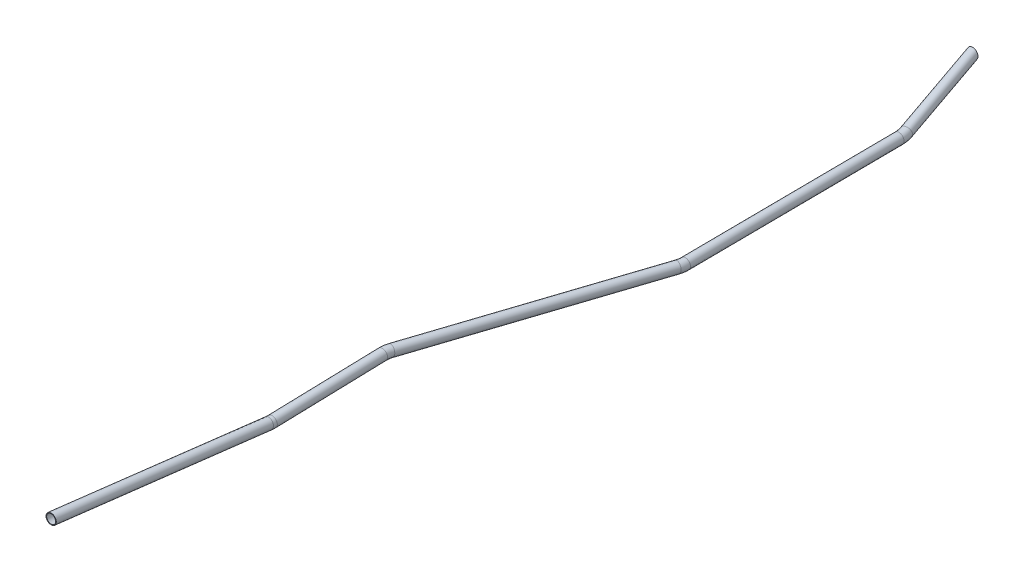
ISO-10303-21;
HEADER;
FILE_DESCRIPTION(('STEP AP214'),'2;1');
FILE_NAME('part.step','',(''),(''),'','','');
FILE_SCHEMA(('AUTOMOTIVE_DESIGN { 1 0 10303 214 1 1 1 1 }'));
ENDSEC;
DATA;
#1=APPLICATION_CONTEXT('core data for automotive mechanical design processes');
#2=APPLICATION_PROTOCOL_DEFINITION('international standard','automotive_design',2000,#1);
#3=PRODUCT_CONTEXT('',#1,'mechanical');
#4=PRODUCT('Part','Part','',(#3));
#5=PRODUCT_RELATED_PRODUCT_CATEGORY('part','',(#4));
#6=PRODUCT_DEFINITION_FORMATION('','',#4);
#7=PRODUCT_DEFINITION_CONTEXT('part definition',#1,'design');
#8=PRODUCT_DEFINITION('design','',#6,#7);
#9=PRODUCT_DEFINITION_SHAPE('','',#8);
#10=(LENGTH_UNIT() NAMED_UNIT(*) SI_UNIT(.MILLI.,.METRE.));
#11=(NAMED_UNIT(*) PLANE_ANGLE_UNIT() SI_UNIT($,.RADIAN.));
#12=(NAMED_UNIT(*) SI_UNIT($,.STERADIAN.) SOLID_ANGLE_UNIT());
#13=UNCERTAINTY_MEASURE_WITH_UNIT(LENGTH_MEASURE(1.E-05),#10,'distance_accuracy_value','');
#14=(GEOMETRIC_REPRESENTATION_CONTEXT(3) GLOBAL_UNCERTAINTY_ASSIGNED_CONTEXT((#13)) GLOBAL_UNIT_ASSIGNED_CONTEXT((#10,
#11,#12)) REPRESENTATION_CONTEXT('',''));
#15=CARTESIAN_POINT('',(0.,0.,0.));
#16=DIRECTION('',(0.,0.,1.));
#17=DIRECTION('',(1.,0.,0.));
#18=AXIS2_PLACEMENT_3D('',#15,#16,#17);
#19=CARTESIAN_POINT('',(199.717136613278,120.618998802633,638.647885750356));
#20=DIRECTION('',(0.00232098852154133,-0.0257434175815316,0.999665888916644));
#21=DIRECTION('',(0.,-0.999668581521457,-0.0257434869215488));
#22=AXIS2_PLACEMENT_3D('',#19,#20,#21);
#23=CYLINDRICAL_SURFACE('',#22,11.049);
#24=CARTESIAN_POINT('',(199.717136613278,120.618998802633,638.647885750356));
#25=DIRECTION('',(0.00232098852154094,-0.0257434175815307,0.999665888916644));
#26=DIRECTION('',(0.,-0.999668581521458,-0.0257434869215479));
#27=AXIS2_PLACEMENT_3D('',#24,#25,#26);
#28=CIRCLE('',#27,11.049);
#29=CARTESIAN_POINT('',(189.809360472102,125.507168864727,638.796769531893));
#30=VERTEX_POINT('',#29);
#31=EDGE_CURVE('E81',#30,#30,#28,.F.);
#32=ORIENTED_EDGE('',*,*,#31,.T.);
#33=EDGE_LOOP('',(#32));
#34=FACE_BOUND('',#33,.T.);
#35=CARTESIAN_POINT('',(200.351887993532,113.578606447965,912.039717245196));
#36=DIRECTION('',(-0.00232098852154094,0.0257434175815307,-0.999665888916644));
#37=DIRECTION('',(0.,0.999668581521458,0.0257434869215479));
#38=AXIS2_PLACEMENT_3D('',#35,#36,#37);
#39=CIRCLE('',#38,11.049);
#40=CARTESIAN_POINT('',(206.675191736784,104.521301997679,911.791792124633));
#41=VERTEX_POINT('',#40);
#42=EDGE_CURVE('E66',#41,#41,#39,.F.);
#43=ORIENTED_EDGE('',*,*,#42,.T.);
#44=EDGE_LOOP('',(#43));
#45=FACE_BOUND('',#44,.T.);
#46=ADVANCED_FACE('F43',(#34,#45),#23,.F.);
#47=CARTESIAN_POINT('',(199.717136613278,120.618998802633,638.647885750356));
#48=DIRECTION('',(0.00232098852154133,-0.0257434175815316,0.999665888916644));
#49=DIRECTION('',(0.,-0.999668581521457,-0.0257434869215488));
#50=AXIS2_PLACEMENT_3D('',#47,#48,#49);
#51=CYLINDRICAL_SURFACE('',#50,12.7);
#52=CARTESIAN_POINT('',(199.717136613278,120.618998802633,638.647885750356));
#53=DIRECTION('',(-0.00232098852154094,0.0257434175815307,-0.999665888916644));
#54=DIRECTION('',(0.,0.999668581521458,0.0257434869215479));
#55=AXIS2_PLACEMENT_3D('',#52,#53,#54);
#56=CIRCLE('',#55,12.7);
#57=CARTESIAN_POINT('',(188.328888175145,126.237585080902,638.819016533732));
#58=VERTEX_POINT('',#57);
#59=EDGE_CURVE('E51',#58,#58,#56,.T.);
#60=ORIENTED_EDGE('',*,*,#59,.F.);
#61=EDGE_LOOP('',(#60));
#62=FACE_BOUND('',#61,.T.);
#63=CARTESIAN_POINT('',(200.351887993532,113.578606447965,912.039717245196));
#64=DIRECTION('',(0.00232098852154094,-0.0257434175815307,0.999665888916644));
#65=DIRECTION('',(0.,-0.999668581521458,-0.0257434869215479));
#66=AXIS2_PLACEMENT_3D('',#63,#64,#65);
#67=CIRCLE('',#66,12.7);
#68=CARTESIAN_POINT('',(207.620053215661,103.167911677521,911.75474584225));
#69=VERTEX_POINT('',#68);
#70=EDGE_CURVE('E10',#69,#69,#67,.T.);
#71=ORIENTED_EDGE('',*,*,#70,.F.);
#72=EDGE_LOOP('',(#71));
#73=FACE_BOUND('',#72,.T.);
#74=ADVANCED_FACE('F45',(#62,#73),#51,.T.);
#75=CARTESIAN_POINT('',(155.579990225219,177.708486233896,913.795141087348));
#76=DIRECTION('',(-0.820043510217333,-0.572157343537613,-0.0128302605749096));
#77=DIRECTION('',(0.572204442360909,-0.820111014523303,0.));
#78=AXIS2_PLACEMENT_3D('',#75,#76,#77);
#79=TOROIDAL_SURFACE('',#78,78.231999999999,11.049);
#80=CARTESIAN_POINT('',(200.097461671143,113.749121177836,920.697327819599));
#81=DIRECTION('',(-0.0609693238725879,0.0650491189961044,0.996017747665346));
#82=DIRECTION('',(0.,-0.997874152520216,0.0651703593059209));
#83=AXIS2_PLACEMENT_3D('',#80,#81,#82);
#84=CIRCLE('',#83,11.049);
#85=CARTESIAN_POINT('',(206.384831826655,104.715899165049,921.672149647044));
#86=VERTEX_POINT('',#85);
#87=EDGE_CURVE('E57',#86,#86,#84,.F.);
#88=CARTESIAN_POINT('',(155.579990225219,177.708486233896,913.795141087348));
#89=DIRECTION('',(-0.820043510217333,-0.572157343537613,-0.0128302605749096));
#90=DIRECTION('',(0.572204442360909,-0.820111014523303,0.));
#91=AXIS2_PLACEMENT_3D('',#88,#89,#90);
#92=CIRCLE('',#91,89.2809999999991);
#93=EDGE_CURVE('',#41,#86,#92,.T.);
#94=ORIENTED_EDGE('',*,*,#42,.F.);
#95=ORIENTED_EDGE('',*,*,#87,.F.);
#96=ORIENTED_EDGE('',*,*,#93,.T.);
#97=ORIENTED_EDGE('',*,*,#93,.F.);
#98=EDGE_LOOP('',(#94,#96,#95,#97));
#99=FACE_BOUND('',#98,.T.);
#100=ADVANCED_FACE('F153',(#99),#79,.F.);
#101=CARTESIAN_POINT('',(155.579990225219,177.708486233896,913.795141087348));
#102=DIRECTION('',(-0.820043510217333,-0.572157343537613,-0.0128302605749096));
#103=DIRECTION('',(0.572204442360909,-0.820111014523303,0.));
#104=AXIS2_PLACEMENT_3D('',#101,#102,#103);
#105=TOROIDAL_SURFACE('',#104,78.231999999999,12.7);
#106=CARTESIAN_POINT('',(200.097461671143,113.749121177836,920.697327819599));
#107=DIRECTION('',(-0.0609693238725879,0.0650491189961044,0.996017747665346));
#108=DIRECTION('',(0.,-0.997874152520216,0.0651703593059209));
#109=AXIS2_PLACEMENT_3D('',#106,#107,#108);
#110=CIRCLE('',#109,12.7);
#111=CARTESIAN_POINT('',(207.324323918858,103.366107370034,921.817812678731));
#112=VERTEX_POINT('',#111);
#113=EDGE_CURVE('E63',#112,#112,#110,.T.);
#114=CARTESIAN_POINT('',(155.579990225219,177.708486233896,913.795141087348));
#115=DIRECTION('',(-0.820043510217333,-0.572157343537613,-0.0128302605749096));
#116=DIRECTION('',(0.572204442360909,-0.820111014523303,0.));
#117=AXIS2_PLACEMENT_3D('',#114,#115,#116);
#118=CIRCLE('',#117,90.931999999999);
#119=EDGE_CURVE('',#69,#112,#118,.T.);
#120=ORIENTED_EDGE('',*,*,#70,.T.);
#121=ORIENTED_EDGE('',*,*,#113,.F.);
#122=ORIENTED_EDGE('',*,*,#119,.T.);
#123=ORIENTED_EDGE('',*,*,#119,.F.);
#124=EDGE_LOOP('',(#120,#122,#121,#123));
#125=FACE_BOUND('',#124,.T.);
#126=ADVANCED_FACE('F157',(#125),#105,.T.);
#127=CARTESIAN_POINT('',(200.097461671143,113.749121177836,920.697327819599));
#128=DIRECTION('',(-0.060969323872588,0.0650491189961044,0.996017747665346));
#129=DIRECTION('',(0.,-0.997874152520216,0.0651703593059209));
#130=AXIS2_PLACEMENT_3D('',#127,#128,#129);
#131=CYLINDRICAL_SURFACE('',#130,11.049);
#132=CARTESIAN_POINT('',(169.052406241099,146.871573201904,1427.86100000001));
#133=DIRECTION('',(0.,0.,1.));
#134=DIRECTION('',(-0.683856204975952,0.729616811015132,0.));
#135=AXIS2_PLACEMENT_3D('',#132,#133,#134);
#136=ELLIPSE('',#135,11.0931758253292,11.049);
#137=CARTESIAN_POINT('',(161.466269120058,154.96534077161,1427.86100000001));
#138=VERTEX_POINT('',#137);
#139=EDGE_CURVE('E77',#138,#138,#136,.T.);
#140=ORIENTED_EDGE('',*,*,#139,.T.);
#141=EDGE_LOOP('',(#140));
#142=FACE_BOUND('',#141,.T.);
#143=ORIENTED_EDGE('',*,*,#87,.T.);
#144=EDGE_LOOP('',(#143));
#145=FACE_BOUND('',#144,.T.);
#146=ADVANCED_FACE('F160',(#142,#145),#131,.F.);
#147=CARTESIAN_POINT('',(200.097461671143,113.749121177836,920.697327819599));
#148=DIRECTION('',(-0.060969323872588,0.0650491189961044,0.996017747665346));
#149=DIRECTION('',(0.,-0.997874152520216,0.0651703593059209));
#150=AXIS2_PLACEMENT_3D('',#147,#148,#149);
#151=CYLINDRICAL_SURFACE('',#150,12.7);
#152=CARTESIAN_POINT('',(169.052406241099,146.871573201904,1427.86100000001));
#153=DIRECTION('',(0.,0.,1.));
#154=DIRECTION('',(-0.683856204975952,0.729616811015132,0.));
#155=AXIS2_PLACEMENT_3D('',#152,#153,#154);
#156=ELLIPSE('',#155,12.7507768107232,12.7);
#157=CARTESIAN_POINT('',(160.332708400823,156.174754316509,1427.86100000001));
#158=VERTEX_POINT('',#157);
#159=EDGE_CURVE('E70',#158,#158,#156,.T.);
#160=ORIENTED_EDGE('',*,*,#159,.F.);
#161=EDGE_LOOP('',(#160));
#162=FACE_BOUND('',#161,.T.);
#163=ORIENTED_EDGE('',*,*,#113,.T.);
#164=EDGE_LOOP('',(#163));
#165=FACE_BOUND('',#164,.T.);
#166=ADVANCED_FACE('F164',(#162,#165),#151,.T.);
#167=CARTESIAN_POINT('',(-171.449999999902,131.825999999957,1427.86100000004));
#168=DIRECTION('',(0.,0.,1.));
#169=DIRECTION('',(1.,0.,0.));
#170=AXIS2_PLACEMENT_3D('',#167,#168,#169);
#171=PLANE('',#170);
#172=ORIENTED_EDGE('',*,*,#139,.F.);
#173=EDGE_LOOP('',(#172));
#174=FACE_BOUND('',#173,.T.);
#175=ORIENTED_EDGE('',*,*,#159,.T.);
#176=EDGE_LOOP('',(#175));
#177=FACE_BOUND('',#176,.T.);
#178=ADVANCED_FACE('F167',(#174,#177),#171,.T.);
#179=CARTESIAN_POINT('',(269.868746992175,86.0085073284976,637.593720124759));
#180=DIRECTION('',(0.442607443900622,0.896444148873497,0.0220576189610958));
#181=DIRECTION('',(-0.896662305803115,0.442715155999704,0.));
#182=AXIS2_PLACEMENT_3D('',#179,#180,#181);
#183=TOROIDAL_SURFACE('',#182,78.2320000000001,11.049);
#184=CARTESIAN_POINT('',(201.719236998237,120.092556861122,619.868944271627));
#185=DIRECTION('',(0.212714548789191,-0.0810653161140511,-0.973745826823787));
#186=DIRECTION('',(-0.976961210122492,0.,-0.213416948520956));
#187=AXIS2_PLACEMENT_3D('',#184,#185,#186);
#188=CIRCLE('',#187,11.049);
#189=CARTESIAN_POINT('',(192.094225034808,124.906375545113,617.36560742224));
#190=VERTEX_POINT('',#189);
#191=EDGE_CURVE('E85',#190,#190,#188,.F.);
#192=CARTESIAN_POINT('',(269.868746992175,86.0085073284976,637.593720124759));
#193=DIRECTION('',(0.442607443900622,0.896444148873497,0.0220576189610958));
#194=DIRECTION('',(-0.896662305803115,0.442715155999704,0.));
#195=AXIS2_PLACEMENT_3D('',#192,#193,#194);
#196=CIRCLE('',#195,89.2810000000001);
#197=EDGE_CURVE('',#190,#30,#196,.T.);
#198=ORIENTED_EDGE('',*,*,#191,.F.);
#199=ORIENTED_EDGE('',*,*,#31,.F.);
#200=ORIENTED_EDGE('',*,*,#197,.T.);
#201=ORIENTED_EDGE('',*,*,#197,.F.);
#202=EDGE_LOOP('',(#198,#200,#199,#201));
#203=FACE_BOUND('',#202,.T.);
#204=ADVANCED_FACE('F174',(#203),#183,.F.);
#205=CARTESIAN_POINT('',(269.868746992175,86.0085073284976,637.593720124759));
#206=DIRECTION('',(0.442607443900622,0.896444148873497,0.0220576189610958));
#207=DIRECTION('',(-0.896662305803115,0.442715155999704,0.));
#208=AXIS2_PLACEMENT_3D('',#205,#206,#207);
#209=TOROIDAL_SURFACE('',#208,78.2320000000001,12.7);
#210=CARTESIAN_POINT('',(201.719236998237,120.092556861122,619.868944271627));
#211=DIRECTION('',(0.212714548789191,-0.0810653161140511,-0.973745826823787));
#212=DIRECTION('',(-0.976961210122492,0.,-0.213416948520956));
#213=AXIS2_PLACEMENT_3D('',#210,#211,#212);
#214=CIRCLE('',#213,12.7);
#215=CARTESIAN_POINT('',(190.656004856364,125.62568178525,616.991545594171));
#216=VERTEX_POINT('',#215);
#217=EDGE_CURVE('E86',#216,#216,#214,.T.);
#218=CARTESIAN_POINT('',(269.868746992175,86.0085073284976,637.593720124759));
#219=DIRECTION('',(0.442607443900622,0.896444148873497,0.0220576189610958));
#220=DIRECTION('',(-0.896662305803115,0.442715155999704,0.));
#221=AXIS2_PLACEMENT_3D('',#218,#219,#220);
#222=CIRCLE('',#221,90.9320000000001);
#223=EDGE_CURVE('',#216,#58,#222,.T.);
#224=ORIENTED_EDGE('',*,*,#217,.F.);
#225=ORIENTED_EDGE('',*,*,#59,.T.);
#226=ORIENTED_EDGE('',*,*,#223,.T.);
#227=ORIENTED_EDGE('',*,*,#223,.F.);
#228=EDGE_LOOP('',(#224,#226,#225,#227));
#229=FACE_BOUND('',#228,.T.);
#230=ADVANCED_FACE('F176',(#229),#209,.T.);
#231=CARTESIAN_POINT('',(328.732320897366,71.687989070569,38.4396950604416));
#232=DIRECTION('',(-0.212714548789192,0.0810653161140514,0.973745826823787));
#233=DIRECTION('',(0.976961210122492,0.,0.213416948520958));
#234=AXIS2_PLACEMENT_3D('',#231,#232,#233);
#235=CYLINDRICAL_SURFACE('',#234,11.049);
#236=CARTESIAN_POINT('',(328.73232089736,71.6879890705716,38.4396950604716));
#237=DIRECTION('',(-0.212714548789191,0.0810653161140512,0.973745826823787));
#238=DIRECTION('',(0.976961210122492,0.,0.213416948520956));
#239=AXIS2_PLACEMENT_3D('',#236,#237,#238);
#240=CIRCLE('',#239,11.049);
#241=CARTESIAN_POINT('',(338.84256325762,68.0084958401836,40.9545966458891));
#242=VERTEX_POINT('',#241);
#243=EDGE_CURVE('E105',#242,#242,#240,.F.);
#244=ORIENTED_EDGE('',*,*,#243,.T.);
#245=EDGE_LOOP('',(#244));
#246=FACE_BOUND('',#245,.T.);
#247=ORIENTED_EDGE('',*,*,#191,.T.);
#248=EDGE_LOOP('',(#247));
#249=FACE_BOUND('',#248,.T.);
#250=ADVANCED_FACE('F179',(#246,#249),#235,.F.);
#251=CARTESIAN_POINT('',(328.732320897366,71.687989070569,38.4396950604416));
#252=DIRECTION('',(-0.212714548789192,0.0810653161140514,0.973745826823787));
#253=DIRECTION('',(0.976961210122492,0.,0.213416948520958));
#254=AXIS2_PLACEMENT_3D('',#251,#252,#253);
#255=CYLINDRICAL_SURFACE('',#254,12.7);
#256=CARTESIAN_POINT('',(328.732320897366,71.6879890705691,38.4396950604423));
#257=DIRECTION('',(0.212714548789191,-0.0810653161140512,-0.973745826823787));
#258=DIRECTION('',(-0.976961210122492,0.,-0.213416948520956));
#259=AXIS2_PLACEMENT_3D('',#256,#257,#258);
#260=CIRCLE('',#259,12.7);
#261=CARTESIAN_POINT('',(340.353289127551,67.4586865069043,41.330386537929));
#262=VERTEX_POINT('',#261);
#263=EDGE_CURVE('E90',#262,#262,#260,.T.);
#264=ORIENTED_EDGE('',*,*,#263,.F.);
#265=EDGE_LOOP('',(#264));
#266=FACE_BOUND('',#265,.T.);
#267=ORIENTED_EDGE('',*,*,#217,.T.);
#268=EDGE_LOOP('',(#267));
#269=FACE_BOUND('',#268,.T.);
#270=ADVANCED_FACE('F184',(#266,#269),#255,.T.);
#271=CARTESIAN_POINT('',(326.042536735937,70.7076293310306,-513.238441419266));
#272=DIRECTION('',(0.00861756932364095,0.000411780998233343,0.99996278327514));
#273=DIRECTION('',(0.999962868053789,0.,-0.00861757005425391));
#274=AXIS2_PLACEMENT_3D('',#271,#272,#273);
#275=CYLINDRICAL_SURFACE('',#274,11.049);
#276=CARTESIAN_POINT('',(326.042536735937,70.7076293310306,-513.238441419236));
#277=DIRECTION('',(0.00861756932328609,0.000411780998393395,0.999962783275142));
#278=DIRECTION('',(0.999962868053793,0.,-0.00861757005389911));
#279=AXIS2_PLACEMENT_3D('',#276,#277,#278);
#280=CIRCLE('',#279,11.049);
#281=CARTESIAN_POINT('',(335.142372679219,64.4412400228412,-513.314282328812));
#282=VERTEX_POINT('',#281);
#283=EDGE_CURVE('E113',#282,#282,#280,.F.);
#284=ORIENTED_EDGE('',*,*,#283,.T.);
#285=EDGE_LOOP('',(#284));
#286=FACE_BOUND('',#285,.T.);
#287=CARTESIAN_POINT('',(330.638019560941,70.9272193840925,20.0107409896821));
#288=DIRECTION('',(-0.00861756932327695,-0.000411780998366864,-0.999962783275142));
#289=DIRECTION('',(-0.999962868053793,0.,0.00861757005388999));
#290=AXIS2_PLACEMENT_3D('',#287,#288,#289);
#291=CIRCLE('',#290,11.049);
#292=CARTESIAN_POINT('',(341.017410920765,67.1402797856466,19.922851983933));
#293=VERTEX_POINT('',#292);
#294=EDGE_CURVE('E109',#293,#293,#291,.F.);
#295=ORIENTED_EDGE('',*,*,#294,.T.);
#296=EDGE_LOOP('',(#295));
#297=FACE_BOUND('',#296,.T.);
#298=ADVANCED_FACE('F187',(#286,#297),#275,.F.);
#299=CARTESIAN_POINT('',(326.042536735937,70.7076293310306,-513.238441419266));
#300=DIRECTION('',(0.00861756932364095,0.000411780998233343,0.99996278327514));
#301=DIRECTION('',(0.999962868053789,0.,-0.00861757005425391));
#302=AXIS2_PLACEMENT_3D('',#299,#300,#301);
#303=CYLINDRICAL_SURFACE('',#302,12.7);
#304=CARTESIAN_POINT('',(326.042536735937,70.7076293310306,-513.238441419266));
#305=DIRECTION('',(-0.00861756932328609,-0.000411780998393395,-0.999962783275142));
#306=DIRECTION('',(-0.999962868053793,0.,0.00861757005389911));
#307=AXIS2_PLACEMENT_3D('',#304,#305,#306);
#308=CIRCLE('',#307,12.7);
#309=CARTESIAN_POINT('',(336.502118279939,63.5048829997785,-513.325614878554));
#310=VERTEX_POINT('',#309);
#311=EDGE_CURVE('E101',#310,#310,#308,.T.);
#312=ORIENTED_EDGE('',*,*,#311,.F.);
#313=EDGE_LOOP('',(#312));
#314=FACE_BOUND('',#313,.T.);
#315=CARTESIAN_POINT('',(330.638019560941,70.9272193840927,20.0107409896517));
#316=DIRECTION('',(0.00861756932328609,0.000411780998393395,0.999962783275142));
#317=DIRECTION('',(0.999962868053793,0.,-0.00861757005389911));
#318=AXIS2_PLACEMENT_3D('',#315,#316,#317);
#319=CIRCLE('',#318,12.7);
#320=CARTESIAN_POINT('',(342.56835445729,66.5744152479479,19.9097191439582));
#321=VERTEX_POINT('',#320);
#322=EDGE_CURVE('E97',#321,#321,#319,.T.);
#323=ORIENTED_EDGE('',*,*,#322,.F.);
#324=EDGE_LOOP('',(#323));
#325=FACE_BOUND('',#324,.T.);
#326=ADVANCED_FACE('F192',(#314,#325),#303,.T.);
#327=CARTESIAN_POINT('',(257.147156599428,97.7404928627444,20.6330355591239));
#328=DIRECTION('',(-0.342724451980664,-0.939430035520991,0.00334041548097114));
#329=DIRECTION('',(0.939435276821439,-0.342726364120744,0.));
#330=AXIS2_PLACEMENT_3D('',#327,#328,#329);
#331=TOROIDAL_SURFACE('',#330,78.232,11.049);
#332=CARTESIAN_POINT('',(257.147156599428,97.7404928627444,20.6330355591239));
#333=DIRECTION('',(-0.342724451980664,-0.939430035520991,0.00334041548097114));
#334=DIRECTION('',(0.939435276821439,-0.342726364120744,0.));
#335=AXIS2_PLACEMENT_3D('',#332,#333,#334);
#336=CIRCLE('',#335,89.281);
#337=EDGE_CURVE('',#293,#242,#336,.T.);
#338=ORIENTED_EDGE('',*,*,#294,.F.);
#339=ORIENTED_EDGE('',*,*,#243,.F.);
#340=ORIENTED_EDGE('',*,*,#337,.T.);
#341=ORIENTED_EDGE('',*,*,#337,.F.);
#342=EDGE_LOOP('',(#338,#340,#339,#341));
#343=FACE_BOUND('',#342,.T.);
#344=ADVANCED_FACE('F195',(#343),#331,.F.);
#345=CARTESIAN_POINT('',(257.147156599428,97.7404928627444,20.6330355591239));
#346=DIRECTION('',(-0.342724451980664,-0.939430035520991,0.00334041548097114));
#347=DIRECTION('',(0.939435276821439,-0.342726364120744,0.));
#348=AXIS2_PLACEMENT_3D('',#345,#346,#347);
#349=TOROIDAL_SURFACE('',#348,78.232,12.7);
#350=CARTESIAN_POINT('',(257.147156599428,97.7404928627444,20.6330355591239));
#351=DIRECTION('',(-0.342724451980664,-0.939430035520991,0.00334041548097114));
#352=DIRECTION('',(0.939435276821439,-0.342726364120744,0.));
#353=AXIS2_PLACEMENT_3D('',#350,#351,#352);
#354=CIRCLE('',#353,90.932);
#355=EDGE_CURVE('',#321,#262,#354,.T.);
#356=ORIENTED_EDGE('',*,*,#322,.T.);
#357=ORIENTED_EDGE('',*,*,#263,.T.);
#358=ORIENTED_EDGE('',*,*,#355,.T.);
#359=ORIENTED_EDGE('',*,*,#355,.F.);
#360=EDGE_LOOP('',(#356,#358,#357,#359));
#361=FACE_BOUND('',#360,.T.);
#362=ADVANCED_FACE('F200',(#361),#349,.T.);
#363=CARTESIAN_POINT('',(261.611506781051,115.076551995291,-512.701452846345));
#364=DIRECTION('',(-0.567121446633834,-0.823617598107258,0.0052265529731863));
#365=DIRECTION('',(0.823628847659389,-0.567129192779975,0.));
#366=AXIS2_PLACEMENT_3D('',#363,#364,#365);
#367=TOROIDAL_SURFACE('',#366,78.2320092811249,11.049);
#368=CARTESIAN_POINT('',(323.45034717119,72.3581790907573,-534.411950577952));
#369=DIRECTION('',(-0.231419568546074,0.15325293336787,-0.960707302828542));
#370=DIRECTION('',(-0.972191808874975,0.,0.234186008882693));
#371=AXIS2_PLACEMENT_3D('',#368,#369,#370);
#372=CIRCLE('',#371,11.049);
#373=CARTESIAN_POINT('',(332.184078462884,66.3249031138345,-537.478205575628));
#374=VERTEX_POINT('',#373);
#375=EDGE_CURVE('E117',#374,#374,#372,.F.);
#376=CARTESIAN_POINT('',(261.611506781051,115.076551995291,-512.701452846345));
#377=DIRECTION('',(-0.567121446633834,-0.823617598107258,0.0052265529731863));
#378=DIRECTION('',(0.823628847659389,-0.567129192779975,0.));
#379=AXIS2_PLACEMENT_3D('',#376,#377,#378);
#380=CIRCLE('',#379,89.2810092811249);
#381=EDGE_CURVE('',#374,#282,#380,.T.);
#382=ORIENTED_EDGE('',*,*,#375,.F.);
#383=ORIENTED_EDGE('',*,*,#283,.F.);
#384=ORIENTED_EDGE('',*,*,#381,.T.);
#385=ORIENTED_EDGE('',*,*,#381,.F.);
#386=EDGE_LOOP('',(#382,#384,#383,#385));
#387=FACE_BOUND('',#386,.T.);
#388=ADVANCED_FACE('F203',(#387),#367,.F.);
#389=CARTESIAN_POINT('',(261.611506781051,115.076551995291,-512.701452846345));
#390=DIRECTION('',(-0.567121446633834,-0.823617598107258,0.0052265529731863));
#391=DIRECTION('',(0.823628847659389,-0.567129192779975,0.));
#392=AXIS2_PLACEMENT_3D('',#389,#390,#391);
#393=TOROIDAL_SURFACE('',#392,78.2320092811249,12.7);
#394=CARTESIAN_POINT('',(323.45034717119,72.3581790907573,-534.411950577952));
#395=DIRECTION('',(-0.231419568546074,0.15325293336787,-0.960707302828542));
#396=DIRECTION('',(-0.972191808874975,0.,0.234186008882693));
#397=AXIS2_PLACEMENT_3D('',#394,#395,#396);
#398=CIRCLE('',#397,12.7);
#399=CARTESIAN_POINT('',(333.489118770838,65.4233791172829,-537.936381609764));
#400=VERTEX_POINT('',#399);
#401=EDGE_CURVE('E118',#400,#400,#398,.T.);
#402=CARTESIAN_POINT('',(261.611506781051,115.076551995291,-512.701452846345));
#403=DIRECTION('',(-0.567121446633834,-0.823617598107258,0.0052265529731863));
#404=DIRECTION('',(0.823628847659389,-0.567129192779975,0.));
#405=AXIS2_PLACEMENT_3D('',#402,#403,#404);
#406=CIRCLE('',#405,90.9320092811249);
#407=EDGE_CURVE('',#400,#310,#406,.T.);
#408=ORIENTED_EDGE('',*,*,#401,.F.);
#409=ORIENTED_EDGE('',*,*,#311,.T.);
#410=ORIENTED_EDGE('',*,*,#407,.T.);
#411=ORIENTED_EDGE('',*,*,#407,.F.);
#412=EDGE_LOOP('',(#408,#410,#409,#411));
#413=FACE_BOUND('',#412,.T.);
#414=ADVANCED_FACE('F208',(#413),#393,.T.);
#415=CARTESIAN_POINT('',(268.329604576294,108.860777143079,-763.238321143163));
#416=DIRECTION('',(0.231419568546415,-0.153252933368021,0.960707302828436));
#417=DIRECTION('',(0.972191808874891,0.,-0.234186008883043));
#418=AXIS2_PLACEMENT_3D('',#415,#416,#417);
#419=CYLINDRICAL_SURFACE('',#418,11.049);
#420=CARTESIAN_POINT('',(271.388838655067,106.834861187154,-750.538321143161));
#421=DIRECTION('',(0.,0.,1.));
#422=DIRECTION('',(0.833753702996067,-0.5521365435654,0.));
#423=AXIS2_PLACEMENT_3D('',#420,#421,#422);
#424=ELLIPSE('',#423,11.5009014373786,11.049);
#425=CARTESIAN_POINT('',(280.977757816275,100.484793219633,-750.538321143162));
#426=VERTEX_POINT('',#425);
#427=EDGE_CURVE('E122',#426,#426,#424,.T.);
#428=ORIENTED_EDGE('',*,*,#427,.F.);
#429=EDGE_LOOP('',(#428));
#430=FACE_BOUND('',#429,.T.);
#431=ORIENTED_EDGE('',*,*,#375,.T.);
#432=EDGE_LOOP('',(#431));
#433=FACE_BOUND('',#432,.T.);
#434=ADVANCED_FACE('F145',(#430,#433),#419,.F.);
#435=CARTESIAN_POINT('',(268.329604576294,108.860777143079,-763.238321143163));
#436=DIRECTION('',(0.231419568546415,-0.153252933368021,0.960707302828436));
#437=DIRECTION('',(0.972191808874891,0.,-0.234186008883043));
#438=AXIS2_PLACEMENT_3D('',#435,#436,#437);
#439=CYLINDRICAL_SURFACE('',#438,12.7);
#440=CARTESIAN_POINT('',(271.388838655067,106.834861187154,-750.538321143161));
#441=DIRECTION('',(0.,0.,1.));
#442=DIRECTION('',(0.833753702996067,-0.5521365435654,0.));
#443=AXIS2_PLACEMENT_3D('',#440,#441,#442);
#444=ELLIPSE('',#443,13.2194269395156,12.7);
#445=CARTESIAN_POINT('',(282.410584817375,99.535932488854,-750.538321143163));
#446=VERTEX_POINT('',#445);
#447=EDGE_CURVE('E129',#446,#446,#444,.T.);
#448=ORIENTED_EDGE('',*,*,#447,.T.);
#449=EDGE_LOOP('',(#448));
#450=FACE_BOUND('',#449,.T.);
#451=ORIENTED_EDGE('',*,*,#401,.T.);
#452=EDGE_LOOP('',(#451));
#453=FACE_BOUND('',#452,.T.);
#454=ADVANCED_FACE('F135',(#450,#453),#439,.T.);
#455=CARTESIAN_POINT('',(-9.76441150157825E-11,4.21190859967169E-11,-750.538321143142));
#456=DIRECTION('',(0.,0.,1.));
#457=DIRECTION('',(1.,0.,0.));
#458=AXIS2_PLACEMENT_3D('',#455,#456,#457);
#459=PLANE('',#458);
#460=ORIENTED_EDGE('',*,*,#427,.T.);
#461=EDGE_LOOP('',(#460));
#462=FACE_BOUND('',#461,.T.);
#463=ORIENTED_EDGE('',*,*,#447,.F.);
#464=EDGE_LOOP('',(#463));
#465=FACE_BOUND('',#464,.T.);
#466=ADVANCED_FACE('F138',(#462,#465),#459,.F.);
#467=CLOSED_SHELL('',(#46,#74,#100,#126,#146,#166,#178,#204,#230,#250,#270,#298,#326,#344,#362,
#388,#414,#434,#454,#466));
#468=MANIFOLD_SOLID_BREP('B2',#467);
#469=ADVANCED_BREP_SHAPE_REPRESENTATION('',(#18,#468),#14);
#470=SHAPE_DEFINITION_REPRESENTATION(#9,#469);
ENDSEC;
END-ISO-10303-21;
